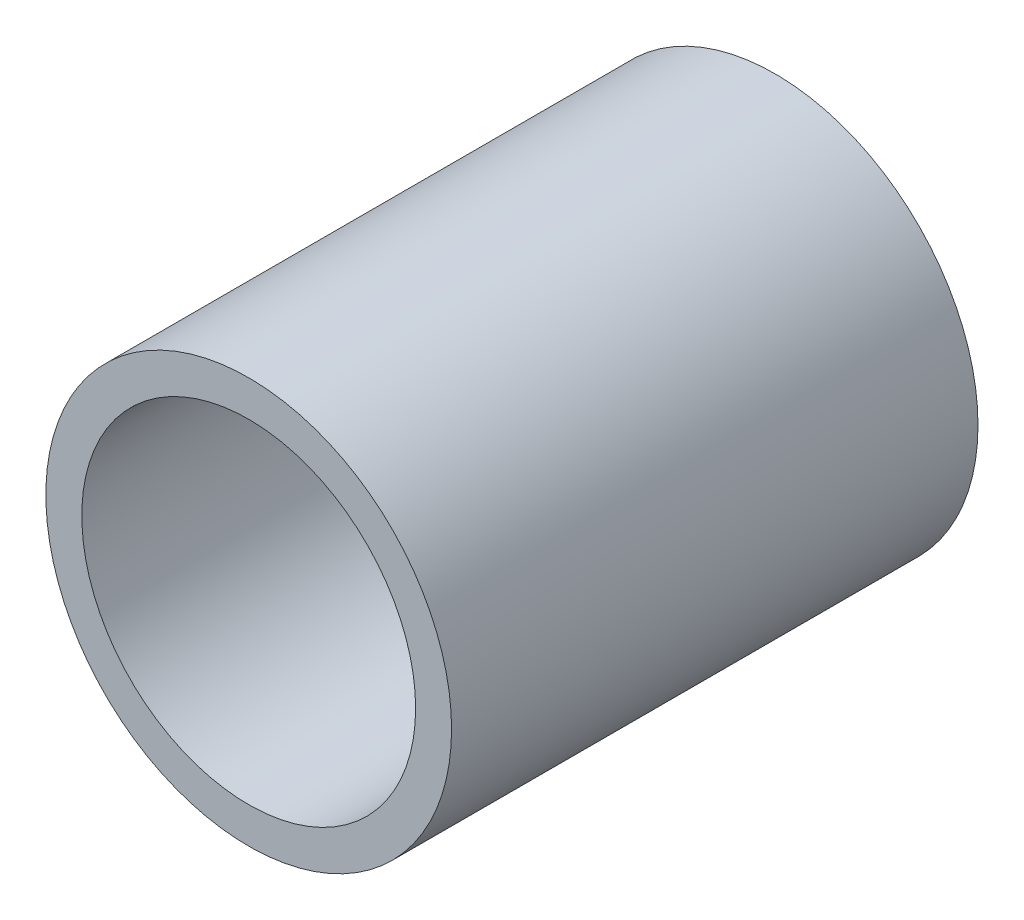
ISO-10303-21;
HEADER;
FILE_DESCRIPTION(('STEP AP214'),'2;1');
FILE_NAME('part.step','',(''),(''),'','','');
FILE_SCHEMA(('AUTOMOTIVE_DESIGN { 1 0 10303 214 1 1 1 1 }'));
ENDSEC;
DATA;
#1=APPLICATION_CONTEXT('core data for automotive mechanical design processes');
#2=APPLICATION_PROTOCOL_DEFINITION('international standard','automotive_design',2000,#1);
#3=PRODUCT_CONTEXT('',#1,'mechanical');
#4=PRODUCT('Part','Part','',(#3));
#5=PRODUCT_RELATED_PRODUCT_CATEGORY('part','',(#4));
#6=PRODUCT_DEFINITION_FORMATION('','',#4);
#7=PRODUCT_DEFINITION_CONTEXT('part definition',#1,'design');
#8=PRODUCT_DEFINITION('design','',#6,#7);
#9=PRODUCT_DEFINITION_SHAPE('','',#8);
#10=(LENGTH_UNIT() NAMED_UNIT(*) SI_UNIT(.MILLI.,.METRE.));
#11=(NAMED_UNIT(*) PLANE_ANGLE_UNIT() SI_UNIT($,.RADIAN.));
#12=(NAMED_UNIT(*) SI_UNIT($,.STERADIAN.) SOLID_ANGLE_UNIT());
#13=UNCERTAINTY_MEASURE_WITH_UNIT(LENGTH_MEASURE(1.E-05),#10,'distance_accuracy_value','');
#14=(GEOMETRIC_REPRESENTATION_CONTEXT(3) GLOBAL_UNCERTAINTY_ASSIGNED_CONTEXT((#13)) GLOBAL_UNIT_ASSIGNED_CONTEXT((#10,
#11,#12)) REPRESENTATION_CONTEXT('',''));
#15=CARTESIAN_POINT('',(0.,0.,0.));
#16=DIRECTION('',(0.,0.,1.));
#17=DIRECTION('',(1.,0.,0.));
#18=AXIS2_PLACEMENT_3D('',#15,#16,#17);
#19=CARTESIAN_POINT('',(0.,0.,52.07));
#20=DIRECTION('',(0.,0.,1.));
#21=DIRECTION('',(1.,0.,0.));
#22=AXIS2_PLACEMENT_3D('',#19,#20,#21);
#23=PLANE('',#22);
#24=CARTESIAN_POINT('',(0.,0.,52.07));
#25=DIRECTION('',(0.,0.,1.));
#26=DIRECTION('',(1.,0.,0.));
#27=AXIS2_PLACEMENT_3D('',#24,#25,#26);
#28=CIRCLE('',#27,20.066);
#29=CARTESIAN_POINT('',(20.066,0.,52.07));
#30=VERTEX_POINT('',#29);
#31=EDGE_CURVE('E10',#30,#30,#28,.T.);
#32=ORIENTED_EDGE('',*,*,#31,.T.);
#33=EDGE_LOOP('',(#32));
#34=FACE_BOUND('',#33,.T.);
#35=CARTESIAN_POINT('',(0.,0.,52.07));
#36=DIRECTION('',(0.,0.,1.));
#37=DIRECTION('',(1.,0.,0.));
#38=AXIS2_PLACEMENT_3D('',#35,#36,#37);
#39=CIRCLE('',#38,16.51);
#40=CARTESIAN_POINT('',(16.51,0.,52.07));
#41=VERTEX_POINT('',#40);
#42=EDGE_CURVE('E45',#41,#41,#39,.T.);
#43=ORIENTED_EDGE('',*,*,#42,.F.);
#44=EDGE_LOOP('',(#43));
#45=FACE_BOUND('',#44,.T.);
#46=ADVANCED_FACE('F34',(#34,#45),#23,.T.);
#47=CARTESIAN_POINT('',(0.,0.,0.));
#48=DIRECTION('',(0.,0.,1.));
#49=DIRECTION('',(1.,0.,0.));
#50=AXIS2_PLACEMENT_3D('',#47,#48,#49);
#51=PLANE('',#50);
#52=CARTESIAN_POINT('',(0.,0.,0.));
#53=DIRECTION('',(0.,0.,1.));
#54=DIRECTION('',(1.,0.,0.));
#55=AXIS2_PLACEMENT_3D('',#52,#53,#54);
#56=CIRCLE('',#55,20.066);
#57=CARTESIAN_POINT('',(20.066,0.,0.));
#58=VERTEX_POINT('',#57);
#59=EDGE_CURVE('E38',#58,#58,#56,.T.);
#60=ORIENTED_EDGE('',*,*,#59,.F.);
#61=EDGE_LOOP('',(#60));
#62=FACE_BOUND('',#61,.T.);
#63=CARTESIAN_POINT('',(0.,0.,0.));
#64=DIRECTION('',(0.,0.,1.));
#65=DIRECTION('',(1.,0.,0.));
#66=AXIS2_PLACEMENT_3D('',#63,#64,#65);
#67=CIRCLE('',#66,16.51);
#68=CARTESIAN_POINT('',(16.51,0.,0.));
#69=VERTEX_POINT('',#68);
#70=EDGE_CURVE('E47',#69,#69,#67,.T.);
#71=ORIENTED_EDGE('',*,*,#70,.T.);
#72=EDGE_LOOP('',(#71));
#73=FACE_BOUND('',#72,.T.);
#74=ADVANCED_FACE('F57',(#62,#73),#51,.F.);
#75=CARTESIAN_POINT('',(0.,0.,52.07));
#76=DIRECTION('',(0.,0.,-1.));
#77=DIRECTION('',(-1.,0.,0.));
#78=AXIS2_PLACEMENT_3D('',#75,#76,#77);
#79=CYLINDRICAL_SURFACE('',#78,20.066);
#80=ORIENTED_EDGE('',*,*,#31,.F.);
#81=EDGE_LOOP('',(#80));
#82=FACE_BOUND('',#81,.T.);
#83=ORIENTED_EDGE('',*,*,#59,.T.);
#84=EDGE_LOOP('',(#83));
#85=FACE_BOUND('',#84,.T.);
#86=ADVANCED_FACE('F36',(#82,#85),#79,.T.);
#87=CARTESIAN_POINT('',(0.,0.,52.07));
#88=DIRECTION('',(0.,0.,-1.));
#89=DIRECTION('',(-1.,0.,0.));
#90=AXIS2_PLACEMENT_3D('',#87,#88,#89);
#91=CYLINDRICAL_SURFACE('',#90,16.51);
#92=ORIENTED_EDGE('',*,*,#42,.T.);
#93=EDGE_LOOP('',(#92));
#94=FACE_BOUND('',#93,.T.);
#95=ORIENTED_EDGE('',*,*,#70,.F.);
#96=EDGE_LOOP('',(#95));
#97=FACE_BOUND('',#96,.T.);
#98=ADVANCED_FACE('F53',(#94,#97),#91,.F.);
#99=CLOSED_SHELL('',(#46,#74,#86,#98));
#100=MANIFOLD_SOLID_BREP('B2',#99);
#101=ADVANCED_BREP_SHAPE_REPRESENTATION('',(#18,#100),#14);
#102=SHAPE_DEFINITION_REPRESENTATION(#9,#101);
ENDSEC;
END-ISO-10303-21;
